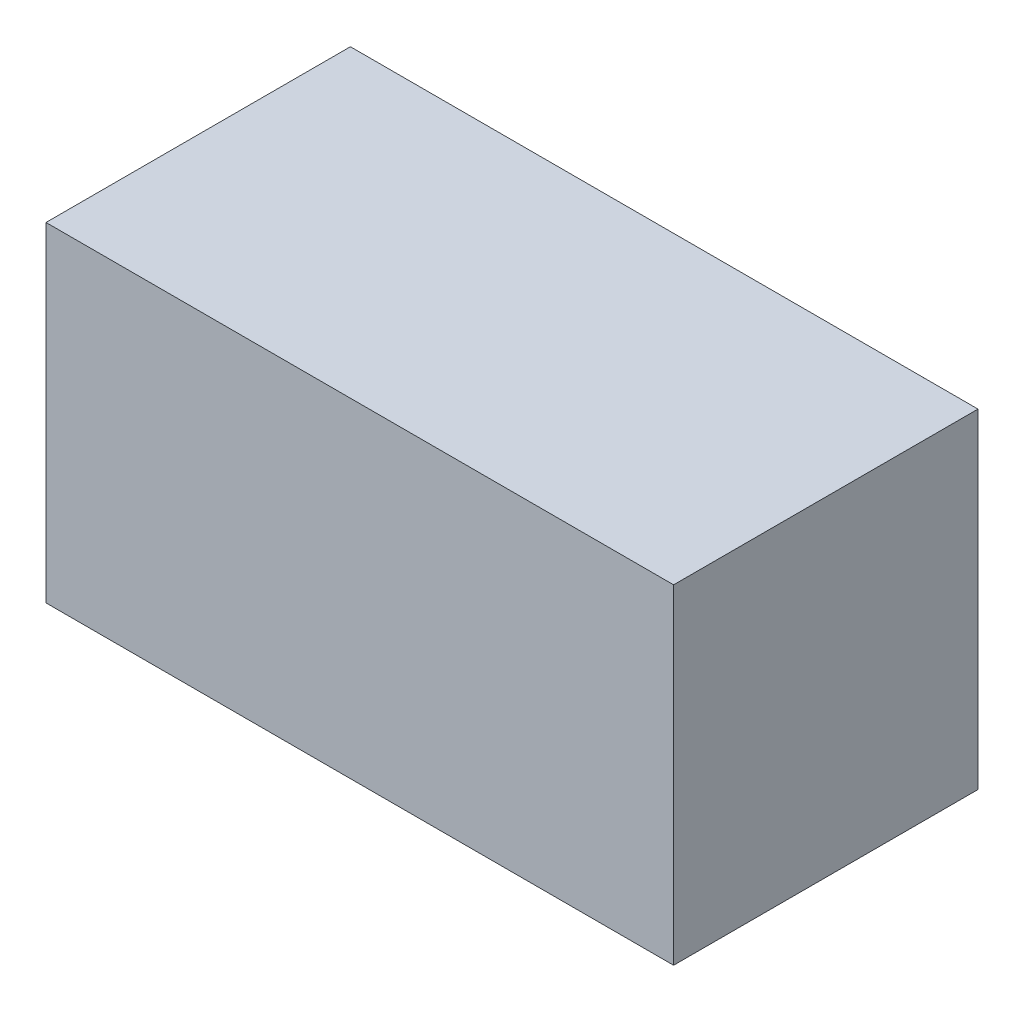
ISO-10303-21;
HEADER;
FILE_DESCRIPTION(('STEP AP214'),'2;1');
FILE_NAME('part.step','',(''),(''),'','','');
FILE_SCHEMA(('AUTOMOTIVE_DESIGN { 1 0 10303 214 1 1 1 1 }'));
ENDSEC;
DATA;
#1=APPLICATION_CONTEXT('core data for automotive mechanical design processes');
#2=APPLICATION_PROTOCOL_DEFINITION('international standard','automotive_design',2000,#1);
#3=PRODUCT_CONTEXT('',#1,'mechanical');
#4=PRODUCT('Part','Part','',(#3));
#5=PRODUCT_RELATED_PRODUCT_CATEGORY('part','',(#4));
#6=PRODUCT_DEFINITION_FORMATION('','',#4);
#7=PRODUCT_DEFINITION_CONTEXT('part definition',#1,'design');
#8=PRODUCT_DEFINITION('design','',#6,#7);
#9=PRODUCT_DEFINITION_SHAPE('','',#8);
#10=(LENGTH_UNIT() NAMED_UNIT(*) SI_UNIT(.MILLI.,.METRE.));
#11=(NAMED_UNIT(*) PLANE_ANGLE_UNIT() SI_UNIT($,.RADIAN.));
#12=(NAMED_UNIT(*) SI_UNIT($,.STERADIAN.) SOLID_ANGLE_UNIT());
#13=UNCERTAINTY_MEASURE_WITH_UNIT(LENGTH_MEASURE(1.E-05),#10,'distance_accuracy_value','');
#14=(GEOMETRIC_REPRESENTATION_CONTEXT(3) GLOBAL_UNCERTAINTY_ASSIGNED_CONTEXT((#13)) GLOBAL_UNIT_ASSIGNED_CONTEXT((#10,
#11,#12)) REPRESENTATION_CONTEXT('',''));
#15=CARTESIAN_POINT('',(0.,0.,0.));
#16=DIRECTION('',(0.,0.,1.));
#17=DIRECTION('',(1.,0.,0.));
#18=AXIS2_PLACEMENT_3D('',#15,#16,#17);
#19=CARTESIAN_POINT('',(0.,10.5,0.));
#20=DIRECTION('',(1.,0.,0.));
#21=DIRECTION('',(0.,0.,-1.));
#22=AXIS2_PLACEMENT_3D('',#19,#20,#21);
#23=PLANE('',#22);
#24=DIRECTION('',(0.,0.,1.));
#25=VECTOR('',#24,1.);
#26=CARTESIAN_POINT('',(0.,0.,0.));
#27=LINE('',#26,#25);
#28=CARTESIAN_POINT('',(0.,0.,-9.7));
#29=VERTEX_POINT('',#28);
#30=CARTESIAN_POINT('',(0.,0.,0.));
#31=VERTEX_POINT('',#30);
#32=EDGE_CURVE('E96',#29,#31,#27,.T.);
#33=ORIENTED_EDGE('',*,*,#32,.T.);
#34=DIRECTION('',(0.,-1.,0.));
#35=VECTOR('',#34,1.);
#36=CARTESIAN_POINT('',(0.,10.5,0.));
#37=LINE('',#36,#35);
#38=CARTESIAN_POINT('',(0.,10.5,0.));
#39=VERTEX_POINT('',#38);
#40=EDGE_CURVE('E11',#39,#31,#37,.T.);
#41=ORIENTED_EDGE('',*,*,#40,.F.);
#42=DIRECTION('',(0.,0.,1.));
#43=VECTOR('',#42,1.);
#44=CARTESIAN_POINT('',(0.,10.5,0.));
#45=LINE('',#44,#43);
#46=CARTESIAN_POINT('',(0.,10.5,-9.7));
#47=VERTEX_POINT('',#46);
#48=EDGE_CURVE('E84',#47,#39,#45,.T.);
#49=ORIENTED_EDGE('',*,*,#48,.F.);
#50=DIRECTION('',(0.,-1.,0.));
#51=VECTOR('',#50,1.);
#52=CARTESIAN_POINT('',(0.,10.5,-9.7));
#53=LINE('',#52,#51);
#54=EDGE_CURVE('E92',#47,#29,#53,.T.);
#55=ORIENTED_EDGE('',*,*,#54,.T.);
#56=EDGE_LOOP('',(#33,#41,#49,#55));
#57=FACE_BOUND('',#56,.T.);
#58=ADVANCED_FACE('F33',(#57),#23,.F.);
#59=CARTESIAN_POINT('',(0.,10.5,0.));
#60=DIRECTION('',(0.,0.,-1.));
#61=DIRECTION('',(-1.,0.,0.));
#62=AXIS2_PLACEMENT_3D('',#59,#60,#61);
#63=PLANE('',#62);
#64=DIRECTION('',(1.,0.,0.));
#65=VECTOR('',#64,1.);
#66=CARTESIAN_POINT('',(0.,0.,0.));
#67=LINE('',#66,#65);
#68=CARTESIAN_POINT('',(20.,0.,0.));
#69=VERTEX_POINT('',#68);
#70=EDGE_CURVE('E88',#31,#69,#67,.T.);
#71=ORIENTED_EDGE('',*,*,#70,.T.);
#72=DIRECTION('',(0.,-1.,0.));
#73=VECTOR('',#72,1.);
#74=CARTESIAN_POINT('',(20.,10.5,0.));
#75=LINE('',#74,#73);
#76=CARTESIAN_POINT('',(20.,10.5,0.));
#77=VERTEX_POINT('',#76);
#78=EDGE_CURVE('E41',#77,#69,#75,.T.);
#79=ORIENTED_EDGE('',*,*,#78,.F.);
#80=DIRECTION('',(1.,0.,0.));
#81=VECTOR('',#80,1.);
#82=CARTESIAN_POINT('',(0.,10.5,0.));
#83=LINE('',#82,#81);
#84=EDGE_CURVE('E79',#39,#77,#83,.T.);
#85=ORIENTED_EDGE('',*,*,#84,.F.);
#86=ORIENTED_EDGE('',*,*,#40,.T.);
#87=EDGE_LOOP('',(#71,#79,#85,#86));
#88=FACE_BOUND('',#87,.T.);
#89=ADVANCED_FACE('F87',(#88),#63,.F.);
#90=CARTESIAN_POINT('',(20.,10.5,0.));
#91=DIRECTION('',(-1.,0.,0.));
#92=DIRECTION('',(0.,0.,1.));
#93=AXIS2_PLACEMENT_3D('',#90,#91,#92);
#94=PLANE('',#93);
#95=DIRECTION('',(0.,0.,-1.));
#96=VECTOR('',#95,1.);
#97=CARTESIAN_POINT('',(20.,0.,0.));
#98=LINE('',#97,#96);
#99=CARTESIAN_POINT('',(20.,0.,-9.7));
#100=VERTEX_POINT('',#99);
#101=EDGE_CURVE('E66',#69,#100,#98,.T.);
#102=ORIENTED_EDGE('',*,*,#101,.T.);
#103=DIRECTION('',(0.,-1.,0.));
#104=VECTOR('',#103,1.);
#105=CARTESIAN_POINT('',(20.,10.5,-9.7));
#106=LINE('',#105,#104);
#107=CARTESIAN_POINT('',(20.,10.5,-9.7));
#108=VERTEX_POINT('',#107);
#109=EDGE_CURVE('E89',#108,#100,#106,.T.);
#110=ORIENTED_EDGE('',*,*,#109,.F.);
#111=DIRECTION('',(0.,0.,-1.));
#112=VECTOR('',#111,1.);
#113=CARTESIAN_POINT('',(20.,10.5,0.));
#114=LINE('',#113,#112);
#115=EDGE_CURVE('E82',#77,#108,#114,.T.);
#116=ORIENTED_EDGE('',*,*,#115,.F.);
#117=ORIENTED_EDGE('',*,*,#78,.T.);
#118=EDGE_LOOP('',(#102,#110,#116,#117));
#119=FACE_BOUND('',#118,.T.);
#120=ADVANCED_FACE('F90',(#119),#94,.F.);
#121=CARTESIAN_POINT('',(0.,10.5,-9.7));
#122=DIRECTION('',(0.,0.,1.));
#123=DIRECTION('',(1.,0.,0.));
#124=AXIS2_PLACEMENT_3D('',#121,#122,#123);
#125=PLANE('',#124);
#126=DIRECTION('',(-1.,0.,0.));
#127=VECTOR('',#126,1.);
#128=CARTESIAN_POINT('',(0.,0.,-9.7));
#129=LINE('',#128,#127);
#130=EDGE_CURVE('E72',#100,#29,#129,.T.);
#131=ORIENTED_EDGE('',*,*,#130,.T.);
#132=ORIENTED_EDGE('',*,*,#54,.F.);
#133=DIRECTION('',(-1.,0.,0.));
#134=VECTOR('',#133,1.);
#135=CARTESIAN_POINT('',(0.,10.5,-9.7));
#136=LINE('',#135,#134);
#137=EDGE_CURVE('E49',#108,#47,#136,.T.);
#138=ORIENTED_EDGE('',*,*,#137,.F.);
#139=ORIENTED_EDGE('',*,*,#109,.T.);
#140=EDGE_LOOP('',(#131,#132,#138,#139));
#141=FACE_BOUND('',#140,.T.);
#142=ADVANCED_FACE('F103',(#141),#125,.F.);
#143=CARTESIAN_POINT('',(0.,10.5,0.));
#144=DIRECTION('',(0.,-1.,0.));
#145=DIRECTION('',(0.,0.,-1.));
#146=AXIS2_PLACEMENT_3D('',#143,#144,#145);
#147=PLANE('',#146);
#148=ORIENTED_EDGE('',*,*,#48,.T.);
#149=ORIENTED_EDGE('',*,*,#84,.T.);
#150=ORIENTED_EDGE('',*,*,#115,.T.);
#151=ORIENTED_EDGE('',*,*,#137,.T.);
#152=EDGE_LOOP('',(#148,#149,#150,#151));
#153=FACE_BOUND('',#152,.T.);
#154=ADVANCED_FACE('F80',(#153),#147,.F.);
#155=CARTESIAN_POINT('',(0.,0.,0.));
#156=DIRECTION('',(0.,-1.,0.));
#157=DIRECTION('',(0.,0.,-1.));
#158=AXIS2_PLACEMENT_3D('',#155,#156,#157);
#159=PLANE('',#158);
#160=ORIENTED_EDGE('',*,*,#32,.F.);
#161=ORIENTED_EDGE('',*,*,#130,.F.);
#162=ORIENTED_EDGE('',*,*,#101,.F.);
#163=ORIENTED_EDGE('',*,*,#70,.F.);
#164=EDGE_LOOP('',(#160,#161,#162,#163));
#165=FACE_BOUND('',#164,.T.);
#166=ADVANCED_FACE('F106',(#165),#159,.T.);
#167=CLOSED_SHELL('',(#58,#89,#120,#142,#154,#166));
#168=MANIFOLD_SOLID_BREP('B2',#167);
#169=ADVANCED_BREP_SHAPE_REPRESENTATION('',(#18,#168),#14);
#170=SHAPE_DEFINITION_REPRESENTATION(#9,#169);
ENDSEC;
END-ISO-10303-21;
